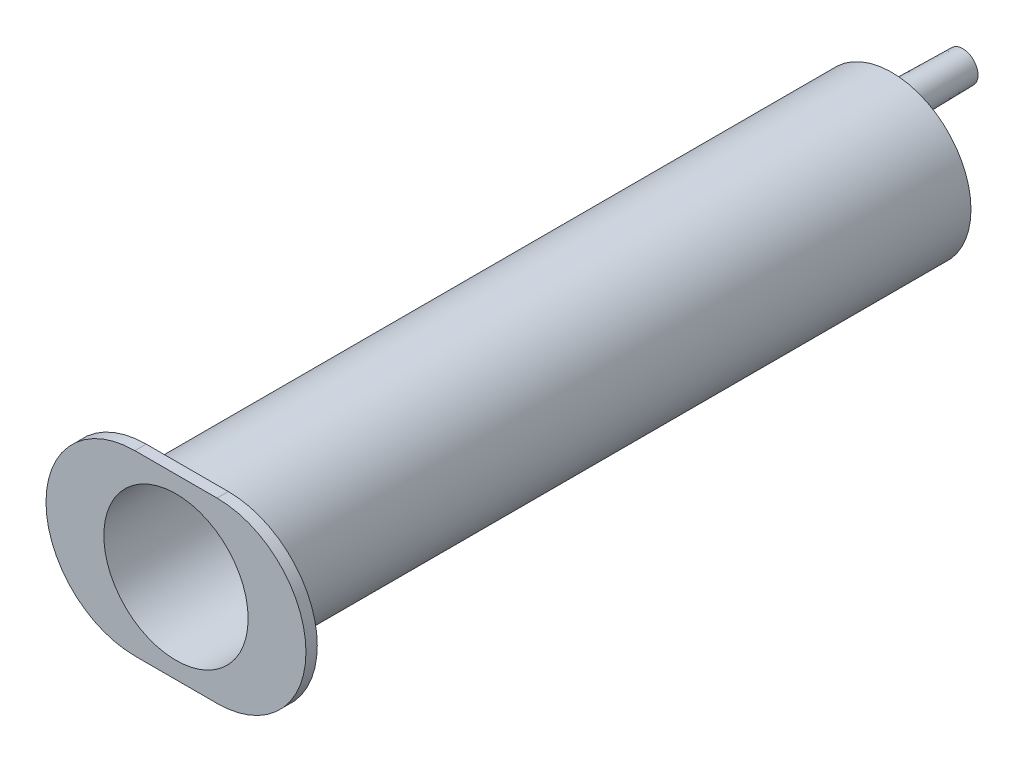
ISO-10303-21;
HEADER;
FILE_DESCRIPTION(('STEP AP214'),'2;1');
FILE_NAME('part.step','',(''),(''),'','','');
FILE_SCHEMA(('AUTOMOTIVE_DESIGN { 1 0 10303 214 1 1 1 1 }'));
ENDSEC;
DATA;
#1=APPLICATION_CONTEXT('core data for automotive mechanical design processes');
#2=APPLICATION_PROTOCOL_DEFINITION('international standard','automotive_design',2000,#1);
#3=PRODUCT_CONTEXT('',#1,'mechanical');
#4=PRODUCT('Part','Part','',(#3));
#5=PRODUCT_RELATED_PRODUCT_CATEGORY('part','',(#4));
#6=PRODUCT_DEFINITION_FORMATION('','',#4);
#7=PRODUCT_DEFINITION_CONTEXT('part definition',#1,'design');
#8=PRODUCT_DEFINITION('design','',#6,#7);
#9=PRODUCT_DEFINITION_SHAPE('','',#8);
#10=(LENGTH_UNIT() NAMED_UNIT(*) SI_UNIT(.MILLI.,.METRE.));
#11=(NAMED_UNIT(*) PLANE_ANGLE_UNIT() SI_UNIT($,.RADIAN.));
#12=(NAMED_UNIT(*) SI_UNIT($,.STERADIAN.) SOLID_ANGLE_UNIT());
#13=UNCERTAINTY_MEASURE_WITH_UNIT(LENGTH_MEASURE(1.E-05),#10,'distance_accuracy_value','');
#14=(GEOMETRIC_REPRESENTATION_CONTEXT(3) GLOBAL_UNCERTAINTY_ASSIGNED_CONTEXT((#13)) GLOBAL_UNIT_ASSIGNED_CONTEXT((#10,
#11,#12)) REPRESENTATION_CONTEXT('',''));
#15=CARTESIAN_POINT('',(0.,0.,0.));
#16=DIRECTION('',(0.,0.,1.));
#17=DIRECTION('',(1.,0.,0.));
#18=AXIS2_PLACEMENT_3D('',#15,#16,#17);
#19=CARTESIAN_POINT('',(0.,0.,0.));
#20=DIRECTION('',(0.,0.,1.));
#21=DIRECTION('',(1.,0.,0.));
#22=AXIS2_PLACEMENT_3D('',#19,#20,#21);
#23=PLANE('',#22);
#24=CARTESIAN_POINT('',(0.,0.,0.));
#25=DIRECTION('',(0.,0.,1.));
#26=DIRECTION('',(1.,0.,0.));
#27=AXIS2_PLACEMENT_3D('',#24,#25,#26);
#28=CIRCLE('',#27,10.5);
#29=CARTESIAN_POINT('',(10.5,0.,0.));
#30=VERTEX_POINT('',#29);
#31=EDGE_CURVE('E118',#30,#30,#28,.T.);
#32=ORIENTED_EDGE('',*,*,#31,.F.);
#33=EDGE_LOOP('',(#32));
#34=FACE_BOUND('',#33,.T.);
#35=CARTESIAN_POINT('',(0.,6.5,0.));
#36=DIRECTION('',(0.,0.,1.));
#37=DIRECTION('',(1.,0.,0.));
#38=AXIS2_PLACEMENT_3D('',#35,#36,#37);
#39=CIRCLE('',#38,2.2);
#40=CARTESIAN_POINT('',(2.2,6.5,0.));
#41=VERTEX_POINT('',#40);
#42=EDGE_CURVE('E12',#41,#41,#39,.F.);
#43=ORIENTED_EDGE('',*,*,#42,.F.);
#44=EDGE_LOOP('',(#43));
#45=FACE_BOUND('',#44,.T.);
#46=ADVANCED_FACE('F37',(#34,#45),#23,.F.);
#47=CARTESIAN_POINT('',(0.,0.,95.));
#48=DIRECTION('',(0.,0.,-1.));
#49=DIRECTION('',(-1.,0.,0.));
#50=AXIS2_PLACEMENT_3D('',#47,#48,#49);
#51=CYLINDRICAL_SURFACE('',#50,10.5);
#52=ORIENTED_EDGE('',*,*,#31,.T.);
#53=EDGE_LOOP('',(#52));
#54=FACE_BOUND('',#53,.T.);
#55=CARTESIAN_POINT('',(0.,0.,93.5));
#56=DIRECTION('',(0.,0.,1.));
#57=DIRECTION('',(1.,0.,0.));
#58=AXIS2_PLACEMENT_3D('',#55,#56,#57);
#59=CIRCLE('',#58,10.5);
#60=CARTESIAN_POINT('',(10.5,0.,93.5));
#61=VERTEX_POINT('',#60);
#62=EDGE_CURVE('E47',#61,#61,#59,.T.);
#63=ORIENTED_EDGE('',*,*,#62,.F.);
#64=EDGE_LOOP('',(#63));
#65=FACE_BOUND('',#64,.T.);
#66=ADVANCED_FACE('F39',(#54,#65),#51,.T.);
#67=CARTESIAN_POINT('',(5.45,0.,93.5));
#68=DIRECTION('',(0.,0.,1.));
#69=DIRECTION('',(1.,0.,0.));
#70=AXIS2_PLACEMENT_3D('',#67,#68,#69);
#71=PLANE('',#70);
#72=CARTESIAN_POINT('',(5.45,0.,93.5));
#73=DIRECTION('',(0.,0.,1.));
#74=DIRECTION('',(1.,0.,0.));
#75=AXIS2_PLACEMENT_3D('',#72,#73,#74);
#76=CIRCLE('',#75,11.8);
#77=CARTESIAN_POINT('',(5.45000000000001,-11.8,93.5));
#78=VERTEX_POINT('',#77);
#79=CARTESIAN_POINT('',(5.44999999999999,11.8,93.5));
#80=VERTEX_POINT('',#79);
#81=EDGE_CURVE('E101',#78,#80,#76,.T.);
#82=ORIENTED_EDGE('',*,*,#81,.F.);
#83=DIRECTION('',(1.,0.,0.));
#84=VECTOR('',#83,1.);
#85=CARTESIAN_POINT('',(5.45000000000001,-11.8,93.5));
#86=LINE('',#85,#84);
#87=CARTESIAN_POINT('',(-5.45,-11.8,93.5));
#88=VERTEX_POINT('',#87);
#89=EDGE_CURVE('E98',#88,#78,#86,.T.);
#90=ORIENTED_EDGE('',*,*,#89,.F.);
#91=CARTESIAN_POINT('',(-5.45,0.,93.5));
#92=DIRECTION('',(0.,0.,1.));
#93=DIRECTION('',(1.,0.,0.));
#94=AXIS2_PLACEMENT_3D('',#91,#92,#93);
#95=CIRCLE('',#94,11.8);
#96=CARTESIAN_POINT('',(-5.45,11.8,93.5));
#97=VERTEX_POINT('',#96);
#98=EDGE_CURVE('E89',#97,#88,#95,.T.);
#99=ORIENTED_EDGE('',*,*,#98,.F.);
#100=DIRECTION('',(-1.,0.,0.));
#101=VECTOR('',#100,1.);
#102=CARTESIAN_POINT('',(5.44999999999999,11.8,93.5));
#103=LINE('',#102,#101);
#104=EDGE_CURVE('E97',#80,#97,#103,.T.);
#105=ORIENTED_EDGE('',*,*,#104,.F.);
#106=EDGE_LOOP('',(#82,#90,#99,#105));
#107=FACE_BOUND('',#106,.T.);
#108=ORIENTED_EDGE('',*,*,#62,.T.);
#109=EDGE_LOOP('',(#108));
#110=FACE_BOUND('',#109,.T.);
#111=ADVANCED_FACE('F95',(#107,#110),#71,.F.);
#112=CARTESIAN_POINT('',(5.45,0.,93.5));
#113=DIRECTION('',(0.,0.,1.));
#114=DIRECTION('',(1.,0.,0.));
#115=AXIS2_PLACEMENT_3D('',#112,#113,#114);
#116=CYLINDRICAL_SURFACE('',#115,11.8);
#117=CARTESIAN_POINT('',(5.45,0.,95.));
#118=DIRECTION('',(0.,0.,1.));
#119=DIRECTION('',(1.,0.,0.));
#120=AXIS2_PLACEMENT_3D('',#117,#118,#119);
#121=CIRCLE('',#120,11.8);
#122=CARTESIAN_POINT('',(5.45000000000001,-11.8,95.));
#123=VERTEX_POINT('',#122);
#124=CARTESIAN_POINT('',(5.44999999999999,11.8,95.));
#125=VERTEX_POINT('',#124);
#126=EDGE_CURVE('E108',#123,#125,#121,.T.);
#127=ORIENTED_EDGE('',*,*,#126,.F.);
#128=DIRECTION('',(0.,0.,1.));
#129=VECTOR('',#128,1.);
#130=CARTESIAN_POINT('',(5.45000000000001,-11.8,93.5));
#131=LINE('',#130,#129);
#132=EDGE_CURVE('E55',#78,#123,#131,.T.);
#133=ORIENTED_EDGE('',*,*,#132,.F.);
#134=ORIENTED_EDGE('',*,*,#81,.T.);
#135=DIRECTION('',(0.,0.,1.));
#136=VECTOR('',#135,1.);
#137=CARTESIAN_POINT('',(5.44999999999999,11.8,93.5));
#138=LINE('',#137,#136);
#139=EDGE_CURVE('E83',#80,#125,#138,.T.);
#140=ORIENTED_EDGE('',*,*,#139,.T.);
#141=EDGE_LOOP('',(#127,#133,#134,#140));
#142=FACE_BOUND('',#141,.T.);
#143=ADVANCED_FACE('F132',(#142),#116,.T.);
#144=CARTESIAN_POINT('',(5.45000000000001,-11.8,93.5));
#145=DIRECTION('',(0.,-1.,0.));
#146=DIRECTION('',(1.,0.,0.));
#147=AXIS2_PLACEMENT_3D('',#144,#145,#146);
#148=PLANE('',#147);
#149=DIRECTION('',(1.,0.,0.));
#150=VECTOR('',#149,1.);
#151=CARTESIAN_POINT('',(5.45000000000001,-11.8,95.));
#152=LINE('',#151,#150);
#153=CARTESIAN_POINT('',(-5.45,-11.8,95.));
#154=VERTEX_POINT('',#153);
#155=EDGE_CURVE('E103',#154,#123,#152,.T.);
#156=ORIENTED_EDGE('',*,*,#155,.F.);
#157=DIRECTION('',(0.,0.,1.));
#158=VECTOR('',#157,1.);
#159=CARTESIAN_POINT('',(-5.45,-11.8,93.5));
#160=LINE('',#159,#158);
#161=EDGE_CURVE('E72',#88,#154,#160,.T.);
#162=ORIENTED_EDGE('',*,*,#161,.F.);
#163=ORIENTED_EDGE('',*,*,#89,.T.);
#164=ORIENTED_EDGE('',*,*,#132,.T.);
#165=EDGE_LOOP('',(#156,#162,#163,#164));
#166=FACE_BOUND('',#165,.T.);
#167=ADVANCED_FACE('F157',(#166),#148,.T.);
#168=CARTESIAN_POINT('',(-5.45,0.,93.5));
#169=DIRECTION('',(0.,0.,1.));
#170=DIRECTION('',(1.,0.,0.));
#171=AXIS2_PLACEMENT_3D('',#168,#169,#170);
#172=CYLINDRICAL_SURFACE('',#171,11.8);
#173=CARTESIAN_POINT('',(-5.45,0.,95.));
#174=DIRECTION('',(0.,0.,1.));
#175=DIRECTION('',(1.,0.,0.));
#176=AXIS2_PLACEMENT_3D('',#173,#174,#175);
#177=CIRCLE('',#176,11.8);
#178=CARTESIAN_POINT('',(-5.45,11.8,95.));
#179=VERTEX_POINT('',#178);
#180=EDGE_CURVE('E91',#179,#154,#177,.T.);
#181=ORIENTED_EDGE('',*,*,#180,.F.);
#182=DIRECTION('',(0.,0.,1.));
#183=VECTOR('',#182,1.);
#184=CARTESIAN_POINT('',(-5.45,11.8,93.5));
#185=LINE('',#184,#183);
#186=EDGE_CURVE('E86',#97,#179,#185,.T.);
#187=ORIENTED_EDGE('',*,*,#186,.F.);
#188=ORIENTED_EDGE('',*,*,#98,.T.);
#189=ORIENTED_EDGE('',*,*,#161,.T.);
#190=EDGE_LOOP('',(#181,#187,#188,#189));
#191=FACE_BOUND('',#190,.T.);
#192=ADVANCED_FACE('F88',(#191),#172,.T.);
#193=CARTESIAN_POINT('',(5.44999999999999,11.8,93.5));
#194=DIRECTION('',(0.,1.,0.));
#195=DIRECTION('',(-1.,0.,0.));
#196=AXIS2_PLACEMENT_3D('',#193,#194,#195);
#197=PLANE('',#196);
#198=DIRECTION('',(-1.,0.,0.));
#199=VECTOR('',#198,1.);
#200=CARTESIAN_POINT('',(5.44999999999999,11.8,95.));
#201=LINE('',#200,#199);
#202=EDGE_CURVE('E111',#125,#179,#201,.T.);
#203=ORIENTED_EDGE('',*,*,#202,.F.);
#204=ORIENTED_EDGE('',*,*,#139,.F.);
#205=ORIENTED_EDGE('',*,*,#104,.T.);
#206=ORIENTED_EDGE('',*,*,#186,.T.);
#207=EDGE_LOOP('',(#203,#204,#205,#206));
#208=FACE_BOUND('',#207,.T.);
#209=ADVANCED_FACE('F100',(#208),#197,.T.);
#210=CARTESIAN_POINT('',(0.,0.,95.));
#211=DIRECTION('',(0.,0.,1.));
#212=DIRECTION('',(1.,0.,0.));
#213=AXIS2_PLACEMENT_3D('',#210,#211,#212);
#214=PLANE('',#213);
#215=CARTESIAN_POINT('',(0.,0.,95.));
#216=DIRECTION('',(0.,0.,1.));
#217=DIRECTION('',(1.,0.,0.));
#218=AXIS2_PLACEMENT_3D('',#215,#216,#217);
#219=CIRCLE('',#218,9.575);
#220=CARTESIAN_POINT('',(9.575,0.,95.));
#221=VERTEX_POINT('',#220);
#222=EDGE_CURVE('E236',#221,#221,#219,.T.);
#223=ORIENTED_EDGE('',*,*,#222,.F.);
#224=EDGE_LOOP('',(#223));
#225=FACE_BOUND('',#224,.T.);
#226=ORIENTED_EDGE('',*,*,#126,.T.);
#227=ORIENTED_EDGE('',*,*,#202,.T.);
#228=ORIENTED_EDGE('',*,*,#180,.T.);
#229=ORIENTED_EDGE('',*,*,#155,.T.);
#230=EDGE_LOOP('',(#226,#227,#228,#229));
#231=FACE_BOUND('',#230,.T.);
#232=ADVANCED_FACE('F142',(#225,#231),#214,.T.);
#233=CARTESIAN_POINT('',(0.,6.5,0.));
#234=DIRECTION('',(0.,0.,1.));
#235=DIRECTION('',(-1.,0.,0.));
#236=AXIS2_PLACEMENT_3D('',#233,#234,#235);
#237=CONICAL_SURFACE('',#236,2.2,0.0174532925199433);
#238=CARTESIAN_POINT('',(0.,6.5,-9.4));
#239=DIRECTION('',(0.,0.,-1.));
#240=DIRECTION('',(-1.,0.,0.));
#241=AXIS2_PLACEMENT_3D('',#238,#239,#240);
#242=CIRCLE('',#241,2.03592238967475);
#243=CARTESIAN_POINT('',(-2.03592238967475,6.5,-9.4));
#244=VERTEX_POINT('',#243);
#245=EDGE_CURVE('E112',#244,#244,#242,.T.);
#246=ORIENTED_EDGE('',*,*,#245,.F.);
#247=EDGE_LOOP('',(#246));
#248=FACE_BOUND('',#247,.T.);
#249=ORIENTED_EDGE('',*,*,#42,.T.);
#250=EDGE_LOOP('',(#249));
#251=FACE_BOUND('',#250,.T.);
#252=ADVANCED_FACE('F139',(#248,#251),#237,.T.);
#253=CARTESIAN_POINT('',(0.,6.5,-9.4));
#254=DIRECTION('',(0.,0.,-1.));
#255=DIRECTION('',(-1.,0.,0.));
#256=AXIS2_PLACEMENT_3D('',#253,#254,#255);
#257=PLANE('',#256);
#258=CARTESIAN_POINT('',(0.,6.5,-9.4));
#259=DIRECTION('',(0.,0.,-1.));
#260=DIRECTION('',(-1.,0.,0.));
#261=AXIS2_PLACEMENT_3D('',#258,#259,#260);
#262=CIRCLE('',#261,1.);
#263=CARTESIAN_POINT('',(-1.,6.5,-9.4));
#264=VERTEX_POINT('',#263);
#265=EDGE_CURVE('E234',#264,#264,#262,.T.);
#266=ORIENTED_EDGE('',*,*,#265,.F.);
#267=EDGE_LOOP('',(#266));
#268=FACE_BOUND('',#267,.T.);
#269=ORIENTED_EDGE('',*,*,#245,.T.);
#270=EDGE_LOOP('',(#269));
#271=FACE_BOUND('',#270,.T.);
#272=ADVANCED_FACE('F141',(#268,#271),#257,.T.);
#273=CARTESIAN_POINT('',(0.,0.,-27.0821897194448));
#274=DIRECTION('',(0.,0.,1.));
#275=DIRECTION('',(1.,0.,0.));
#276=AXIS2_PLACEMENT_3D('',#273,#274,#275);
#277=CYLINDRICAL_SURFACE('',#276,9.575);
#278=CARTESIAN_POINT('',(0.,0.,1.5));
#279=DIRECTION('',(0.,0.,1.));
#280=DIRECTION('',(1.,0.,0.));
#281=AXIS2_PLACEMENT_3D('',#278,#279,#280);
#282=CIRCLE('',#281,9.575);
#283=CARTESIAN_POINT('',(9.575,0.,1.5));
#284=VERTEX_POINT('',#283);
#285=EDGE_CURVE('E240',#284,#284,#282,.F.);
#286=ORIENTED_EDGE('',*,*,#285,.T.);
#287=EDGE_LOOP('',(#286));
#288=FACE_BOUND('',#287,.T.);
#289=ORIENTED_EDGE('',*,*,#222,.T.);
#290=EDGE_LOOP('',(#289));
#291=FACE_BOUND('',#290,.T.);
#292=ADVANCED_FACE('F149',(#288,#291),#277,.F.);
#293=CARTESIAN_POINT('',(0.,0.,1.5));
#294=DIRECTION('',(0.,0.,1.));
#295=DIRECTION('',(1.,0.,0.));
#296=AXIS2_PLACEMENT_3D('',#293,#294,#295);
#297=PLANE('',#296);
#298=CARTESIAN_POINT('',(0.,6.5,1.5));
#299=DIRECTION('',(0.,0.,1.));
#300=DIRECTION('',(1.,0.,0.));
#301=AXIS2_PLACEMENT_3D('',#298,#299,#300);
#302=CIRCLE('',#301,1.);
#303=CARTESIAN_POINT('',(1.,6.5,1.5));
#304=VERTEX_POINT('',#303);
#305=EDGE_CURVE('E41',#304,#304,#302,.T.);
#306=ORIENTED_EDGE('',*,*,#305,.F.);
#307=EDGE_LOOP('',(#306));
#308=FACE_BOUND('',#307,.T.);
#309=ORIENTED_EDGE('',*,*,#285,.F.);
#310=EDGE_LOOP('',(#309));
#311=FACE_BOUND('',#310,.T.);
#312=ADVANCED_FACE('F200',(#308,#311),#297,.T.);
#313=CARTESIAN_POINT('',(0.,6.5,95.));
#314=DIRECTION('',(0.,0.,-1.));
#315=DIRECTION('',(-1.,0.,0.));
#316=AXIS2_PLACEMENT_3D('',#313,#314,#315);
#317=CYLINDRICAL_SURFACE('',#316,1.);
#318=ORIENTED_EDGE('',*,*,#305,.T.);
#319=EDGE_LOOP('',(#318));
#320=FACE_BOUND('',#319,.T.);
#321=ORIENTED_EDGE('',*,*,#265,.T.);
#322=EDGE_LOOP('',(#321));
#323=FACE_BOUND('',#322,.T.);
#324=ADVANCED_FACE('F215',(#320,#323),#317,.F.);
#325=CLOSED_SHELL('',(#46,#66,#111,#143,#167,#192,#209,#232,#252,#272,#292,#312,#324));
#326=MANIFOLD_SOLID_BREP('B2',#325);
#327=ADVANCED_BREP_SHAPE_REPRESENTATION('',(#18,#326),#14);
#328=SHAPE_DEFINITION_REPRESENTATION(#9,#327);
ENDSEC;
END-ISO-10303-21;
